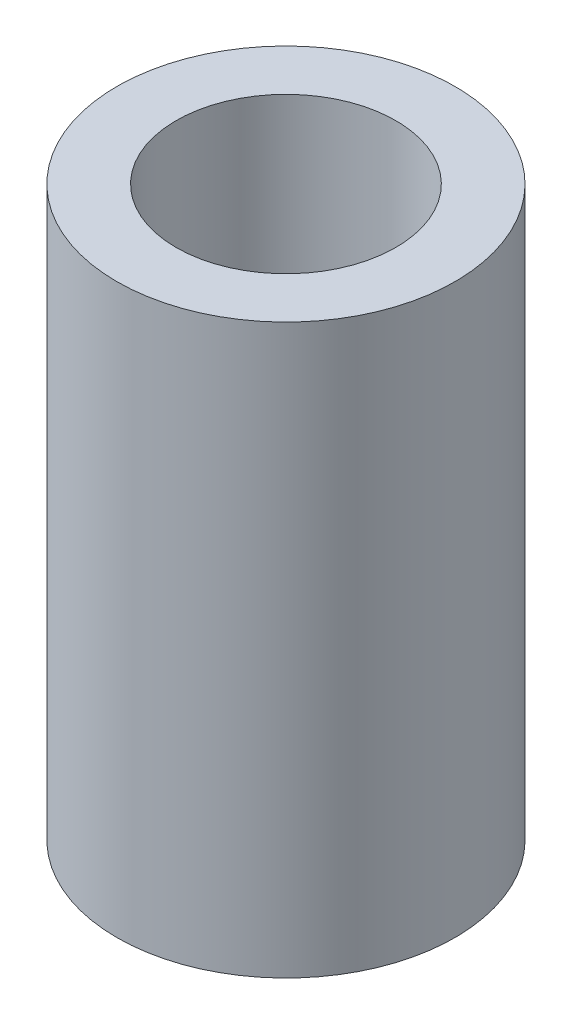
ISO-10303-21;
HEADER;
FILE_DESCRIPTION(('STEP AP214'),'2;1');
FILE_NAME('part.step','',(''),(''),'','','');
FILE_SCHEMA(('AUTOMOTIVE_DESIGN { 1 0 10303 214 1 1 1 1 }'));
ENDSEC;
DATA;
#1=APPLICATION_CONTEXT('core data for automotive mechanical design processes');
#2=APPLICATION_PROTOCOL_DEFINITION('international standard','automotive_design',2000,#1);
#3=PRODUCT_CONTEXT('',#1,'mechanical');
#4=PRODUCT('Part','Part','',(#3));
#5=PRODUCT_RELATED_PRODUCT_CATEGORY('part','',(#4));
#6=PRODUCT_DEFINITION_FORMATION('','',#4);
#7=PRODUCT_DEFINITION_CONTEXT('part definition',#1,'design');
#8=PRODUCT_DEFINITION('design','',#6,#7);
#9=PRODUCT_DEFINITION_SHAPE('','',#8);
#10=(LENGTH_UNIT() NAMED_UNIT(*) SI_UNIT(.MILLI.,.METRE.));
#11=(NAMED_UNIT(*) PLANE_ANGLE_UNIT() SI_UNIT($,.RADIAN.));
#12=(NAMED_UNIT(*) SI_UNIT($,.STERADIAN.) SOLID_ANGLE_UNIT());
#13=UNCERTAINTY_MEASURE_WITH_UNIT(LENGTH_MEASURE(1.E-05),#10,'distance_accuracy_value','');
#14=(GEOMETRIC_REPRESENTATION_CONTEXT(3) GLOBAL_UNCERTAINTY_ASSIGNED_CONTEXT((#13)) GLOBAL_UNIT_ASSIGNED_CONTEXT((#10,
#11,#12)) REPRESENTATION_CONTEXT('',''));
#15=CARTESIAN_POINT('',(0.,0.,0.));
#16=DIRECTION('',(0.,0.,1.));
#17=DIRECTION('',(1.,0.,0.));
#18=AXIS2_PLACEMENT_3D('',#15,#16,#17);
#19=CARTESIAN_POINT('',(0.,8.4,0.));
#20=DIRECTION('',(0.,1.,0.));
#21=DIRECTION('',(0.,0.,1.));
#22=AXIS2_PLACEMENT_3D('',#19,#20,#21);
#23=PLANE('',#22);
#24=CARTESIAN_POINT('',(0.,8.4,0.));
#25=DIRECTION('',(0.,1.,0.));
#26=DIRECTION('',(0.,0.,1.));
#27=AXIS2_PLACEMENT_3D('',#24,#25,#26);
#28=CIRCLE('',#27,2.5);
#29=CARTESIAN_POINT('',(0.,8.4,2.5));
#30=VERTEX_POINT('',#29);
#31=EDGE_CURVE('E10',#30,#30,#28,.T.);
#32=ORIENTED_EDGE('',*,*,#31,.T.);
#33=EDGE_LOOP('',(#32));
#34=FACE_BOUND('',#33,.T.);
#35=CARTESIAN_POINT('',(0.,8.4,0.));
#36=DIRECTION('',(0.,1.,0.));
#37=DIRECTION('',(0.,0.,1.));
#38=AXIS2_PLACEMENT_3D('',#35,#36,#37);
#39=CIRCLE('',#38,1.625);
#40=CARTESIAN_POINT('',(0.,8.4,1.625));
#41=VERTEX_POINT('',#40);
#42=EDGE_CURVE('E50',#41,#41,#39,.T.);
#43=ORIENTED_EDGE('',*,*,#42,.F.);
#44=EDGE_LOOP('',(#43));
#45=FACE_BOUND('',#44,.T.);
#46=ADVANCED_FACE('F37',(#34,#45),#23,.T.);
#47=CARTESIAN_POINT('',(0.,0.,0.));
#48=DIRECTION('',(0.,1.,0.));
#49=DIRECTION('',(0.,0.,1.));
#50=AXIS2_PLACEMENT_3D('',#47,#48,#49);
#51=PLANE('',#50);
#52=CARTESIAN_POINT('',(0.,0.,0.));
#53=DIRECTION('',(0.,1.,0.));
#54=DIRECTION('',(0.,0.,1.));
#55=AXIS2_PLACEMENT_3D('',#52,#53,#54);
#56=CIRCLE('',#55,2.5);
#57=CARTESIAN_POINT('',(0.,0.,2.5));
#58=VERTEX_POINT('',#57);
#59=EDGE_CURVE('E41',#58,#58,#56,.T.);
#60=ORIENTED_EDGE('',*,*,#59,.F.);
#61=EDGE_LOOP('',(#60));
#62=FACE_BOUND('',#61,.T.);
#63=CARTESIAN_POINT('',(0.,0.,0.));
#64=DIRECTION('',(0.,1.,0.));
#65=DIRECTION('',(0.,0.,1.));
#66=AXIS2_PLACEMENT_3D('',#63,#64,#65);
#67=CIRCLE('',#66,1.625);
#68=CARTESIAN_POINT('',(0.,0.,1.625));
#69=VERTEX_POINT('',#68);
#70=EDGE_CURVE('E52',#69,#69,#67,.T.);
#71=ORIENTED_EDGE('',*,*,#70,.T.);
#72=EDGE_LOOP('',(#71));
#73=FACE_BOUND('',#72,.T.);
#74=ADVANCED_FACE('F64',(#62,#73),#51,.F.);
#75=CARTESIAN_POINT('',(0.,8.4,0.));
#76=DIRECTION('',(0.,-1.,0.));
#77=DIRECTION('',(0.,0.,-1.));
#78=AXIS2_PLACEMENT_3D('',#75,#76,#77);
#79=CYLINDRICAL_SURFACE('',#78,2.5);
#80=ORIENTED_EDGE('',*,*,#31,.F.);
#81=EDGE_LOOP('',(#80));
#82=FACE_BOUND('',#81,.T.);
#83=ORIENTED_EDGE('',*,*,#59,.T.);
#84=EDGE_LOOP('',(#83));
#85=FACE_BOUND('',#84,.T.);
#86=ADVANCED_FACE('F39',(#82,#85),#79,.T.);
#87=CARTESIAN_POINT('',(0.,8.4,0.));
#88=DIRECTION('',(0.,-1.,0.));
#89=DIRECTION('',(0.,0.,-1.));
#90=AXIS2_PLACEMENT_3D('',#87,#88,#89);
#91=CYLINDRICAL_SURFACE('',#90,1.625);
#92=ORIENTED_EDGE('',*,*,#42,.T.);
#93=EDGE_LOOP('',(#92));
#94=FACE_BOUND('',#93,.T.);
#95=ORIENTED_EDGE('',*,*,#70,.F.);
#96=EDGE_LOOP('',(#95));
#97=FACE_BOUND('',#96,.T.);
#98=ADVANCED_FACE('F60',(#94,#97),#91,.F.);
#99=CLOSED_SHELL('',(#46,#74,#86,#98));
#100=MANIFOLD_SOLID_BREP('B2',#99);
#101=ADVANCED_BREP_SHAPE_REPRESENTATION('',(#18,#100),#14);
#102=SHAPE_DEFINITION_REPRESENTATION(#9,#101);
ENDSEC;
END-ISO-10303-21;
